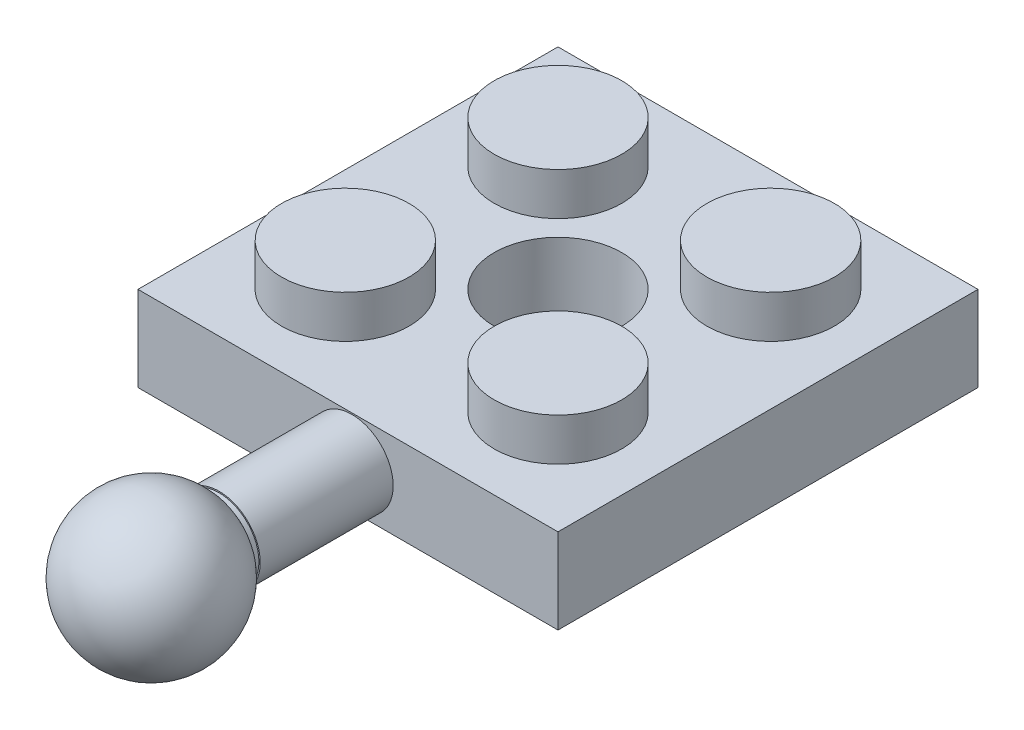
ISO-10303-21;
HEADER;
FILE_DESCRIPTION(('STEP AP214'),'2;1');
FILE_NAME('part.step','',(''),(''),'','','');
FILE_SCHEMA(('AUTOMOTIVE_DESIGN { 1 0 10303 214 1 1 1 1 }'));
ENDSEC;
DATA;
#1=APPLICATION_CONTEXT('core data for automotive mechanical design processes');
#2=APPLICATION_PROTOCOL_DEFINITION('international standard','automotive_design',2000,#1);
#3=PRODUCT_CONTEXT('',#1,'mechanical');
#4=PRODUCT('Part','Part','',(#3));
#5=PRODUCT_RELATED_PRODUCT_CATEGORY('part','',(#4));
#6=PRODUCT_DEFINITION_FORMATION('','',#4);
#7=PRODUCT_DEFINITION_CONTEXT('part definition',#1,'design');
#8=PRODUCT_DEFINITION('design','',#6,#7);
#9=PRODUCT_DEFINITION_SHAPE('','',#8);
#10=(LENGTH_UNIT() NAMED_UNIT(*) SI_UNIT(.MILLI.,.METRE.));
#11=(NAMED_UNIT(*) PLANE_ANGLE_UNIT() SI_UNIT($,.RADIAN.));
#12=(NAMED_UNIT(*) SI_UNIT($,.STERADIAN.) SOLID_ANGLE_UNIT());
#13=UNCERTAINTY_MEASURE_WITH_UNIT(LENGTH_MEASURE(1.E-05),#10,'distance_accuracy_value','');
#14=(GEOMETRIC_REPRESENTATION_CONTEXT(3) GLOBAL_UNCERTAINTY_ASSIGNED_CONTEXT((#13)) GLOBAL_UNIT_ASSIGNED_CONTEXT((#10,
#11,#12)) REPRESENTATION_CONTEXT('',''));
#15=CARTESIAN_POINT('',(0.,0.,0.));
#16=DIRECTION('',(0.,0.,1.));
#17=DIRECTION('',(1.,0.,0.));
#18=AXIS2_PLACEMENT_3D('',#15,#16,#17);
#19=CARTESIAN_POINT('',(0.,0.,-15.8));
#20=DIRECTION('',(0.,-1.,0.));
#21=DIRECTION('',(0.,0.,-1.));
#22=AXIS2_PLACEMENT_3D('',#19,#20,#21);
#23=PLANE('',#22);
#24=DIRECTION('',(1.,0.,0.));
#25=VECTOR('',#24,1.);
#26=CARTESIAN_POINT('',(0.,0.,0.));
#27=LINE('',#26,#25);
#28=CARTESIAN_POINT('',(0.,0.,0.));
#29=VERTEX_POINT('',#28);
#30=CARTESIAN_POINT('',(15.8,0.,0.));
#31=VERTEX_POINT('',#30);
#32=EDGE_CURVE('E198',#29,#31,#27,.T.);
#33=ORIENTED_EDGE('',*,*,#32,.F.);
#34=DIRECTION('',(0.,0.,1.));
#35=VECTOR('',#34,1.);
#36=CARTESIAN_POINT('',(0.,0.,-15.8));
#37=LINE('',#36,#35);
#38=CARTESIAN_POINT('',(0.,0.,-15.8));
#39=VERTEX_POINT('',#38);
#40=EDGE_CURVE('E93',#39,#29,#37,.T.);
#41=ORIENTED_EDGE('',*,*,#40,.F.);
#42=DIRECTION('',(1.,0.,0.));
#43=VECTOR('',#42,1.);
#44=CARTESIAN_POINT('',(0.,0.,-15.8));
#45=LINE('',#44,#43);
#46=CARTESIAN_POINT('',(15.8,0.,-15.8));
#47=VERTEX_POINT('',#46);
#48=EDGE_CURVE('E188',#39,#47,#45,.T.);
#49=ORIENTED_EDGE('',*,*,#48,.T.);
#50=DIRECTION('',(0.,0.,1.));
#51=VECTOR('',#50,1.);
#52=CARTESIAN_POINT('',(15.8,0.,-15.8));
#53=LINE('',#52,#51);
#54=EDGE_CURVE('E210',#47,#31,#53,.T.);
#55=ORIENTED_EDGE('',*,*,#54,.T.);
#56=EDGE_LOOP('',(#33,#41,#49,#55));
#57=FACE_BOUND('',#56,.T.);
#58=DIRECTION('',(0.,0.,1.));
#59=VECTOR('',#58,1.);
#60=CARTESIAN_POINT('',(1.2,0.,-15.8));
#61=LINE('',#60,#59);
#62=CARTESIAN_POINT('',(1.2,0.,-14.6));
#63=VERTEX_POINT('',#62);
#64=CARTESIAN_POINT('',(1.2,0.,-1.2));
#65=VERTEX_POINT('',#64);
#66=EDGE_CURVE('E138',#63,#65,#61,.T.);
#67=ORIENTED_EDGE('',*,*,#66,.T.);
#68=DIRECTION('',(1.,0.,0.));
#69=VECTOR('',#68,1.);
#70=CARTESIAN_POINT('',(0.,0.,-1.2));
#71=LINE('',#70,#69);
#72=CARTESIAN_POINT('',(14.6,0.,-1.2));
#73=VERTEX_POINT('',#72);
#74=EDGE_CURVE('E155',#65,#73,#71,.T.);
#75=ORIENTED_EDGE('',*,*,#74,.T.);
#76=DIRECTION('',(0.,0.,1.));
#77=VECTOR('',#76,1.);
#78=CARTESIAN_POINT('',(14.6,0.,-15.8));
#79=LINE('',#78,#77);
#80=CARTESIAN_POINT('',(14.6,0.,-14.6));
#81=VERTEX_POINT('',#80);
#82=EDGE_CURVE('E129',#81,#73,#79,.T.);
#83=ORIENTED_EDGE('',*,*,#82,.F.);
#84=DIRECTION('',(1.,0.,0.));
#85=VECTOR('',#84,1.);
#86=CARTESIAN_POINT('',(0.,0.,-14.6));
#87=LINE('',#86,#85);
#88=EDGE_CURVE('E58',#63,#81,#87,.T.);
#89=ORIENTED_EDGE('',*,*,#88,.F.);
#90=EDGE_LOOP('',(#67,#75,#83,#89));
#91=FACE_BOUND('',#90,.T.);
#92=ADVANCED_FACE('F41',(#57,#91),#23,.T.);
#93=CARTESIAN_POINT('',(11.9,4.8,-11.9));
#94=DIRECTION('',(0.,1.,0.));
#95=DIRECTION('',(0.,0.,1.));
#96=AXIS2_PLACEMENT_3D('',#93,#94,#95);
#97=PLANE('',#96);
#98=CARTESIAN_POINT('',(11.9,4.8,-11.9));
#99=DIRECTION('',(0.,1.,0.));
#100=DIRECTION('',(0.,0.,1.));
#101=AXIS2_PLACEMENT_3D('',#98,#99,#100);
#102=CIRCLE('',#101,2.4);
#103=CARTESIAN_POINT('',(11.9,4.8,-9.5));
#104=VERTEX_POINT('',#103);
#105=EDGE_CURVE('E221',#104,#104,#102,.T.);
#106=ORIENTED_EDGE('',*,*,#105,.T.);
#107=EDGE_LOOP('',(#106));
#108=FACE_BOUND('',#107,.T.);
#109=ADVANCED_FACE('F43',(#108),#97,.T.);
#110=CARTESIAN_POINT('',(11.9,4.8,-11.9));
#111=DIRECTION('',(0.,-1.,0.));
#112=DIRECTION('',(0.,0.,-1.));
#113=AXIS2_PLACEMENT_3D('',#110,#111,#112);
#114=CYLINDRICAL_SURFACE('',#113,2.4);
#115=ORIENTED_EDGE('',*,*,#105,.F.);
#116=EDGE_LOOP('',(#115));
#117=FACE_BOUND('',#116,.T.);
#118=CARTESIAN_POINT('',(11.9,3.2,-11.9));
#119=DIRECTION('',(0.,1.,0.));
#120=DIRECTION('',(0.,0.,1.));
#121=AXIS2_PLACEMENT_3D('',#118,#119,#120);
#122=CIRCLE('',#121,2.4);
#123=CARTESIAN_POINT('',(11.9,3.2,-9.5));
#124=VERTEX_POINT('',#123);
#125=EDGE_CURVE('E218',#124,#124,#122,.T.);
#126=ORIENTED_EDGE('',*,*,#125,.T.);
#127=EDGE_LOOP('',(#126));
#128=FACE_BOUND('',#127,.T.);
#129=ADVANCED_FACE('F252',(#117,#128),#114,.T.);
#130=CARTESIAN_POINT('',(11.9,4.8,-3.9));
#131=DIRECTION('',(0.,1.,0.));
#132=DIRECTION('',(0.,0.,1.));
#133=AXIS2_PLACEMENT_3D('',#130,#131,#132);
#134=PLANE('',#133);
#135=CARTESIAN_POINT('',(11.9,4.8,-3.9));
#136=DIRECTION('',(0.,1.,0.));
#137=DIRECTION('',(0.,0.,1.));
#138=AXIS2_PLACEMENT_3D('',#135,#136,#137);
#139=CIRCLE('',#138,2.4);
#140=CARTESIAN_POINT('',(11.9,4.8,-1.5));
#141=VERTEX_POINT('',#140);
#142=EDGE_CURVE('E215',#141,#141,#139,.T.);
#143=ORIENTED_EDGE('',*,*,#142,.T.);
#144=EDGE_LOOP('',(#143));
#145=FACE_BOUND('',#144,.T.);
#146=ADVANCED_FACE('F265',(#145),#134,.T.);
#147=CARTESIAN_POINT('',(11.9,4.8,-3.9));
#148=DIRECTION('',(0.,-1.,0.));
#149=DIRECTION('',(0.,0.,-1.));
#150=AXIS2_PLACEMENT_3D('',#147,#148,#149);
#151=CYLINDRICAL_SURFACE('',#150,2.4);
#152=ORIENTED_EDGE('',*,*,#142,.F.);
#153=EDGE_LOOP('',(#152));
#154=FACE_BOUND('',#153,.T.);
#155=CARTESIAN_POINT('',(11.9,3.2,-3.9));
#156=DIRECTION('',(0.,1.,0.));
#157=DIRECTION('',(0.,0.,1.));
#158=AXIS2_PLACEMENT_3D('',#155,#156,#157);
#159=CIRCLE('',#158,2.4);
#160=CARTESIAN_POINT('',(11.9,3.2,-1.5));
#161=VERTEX_POINT('',#160);
#162=EDGE_CURVE('E207',#161,#161,#159,.T.);
#163=ORIENTED_EDGE('',*,*,#162,.T.);
#164=EDGE_LOOP('',(#163));
#165=FACE_BOUND('',#164,.T.);
#166=ADVANCED_FACE('F262',(#154,#165),#151,.T.);
#167=CARTESIAN_POINT('',(0.,0.,-15.8));
#168=DIRECTION('',(-1.,0.,0.));
#169=DIRECTION('',(0.,0.,1.));
#170=AXIS2_PLACEMENT_3D('',#167,#168,#169);
#171=PLANE('',#170);
#172=DIRECTION('',(0.,-1.,0.));
#173=VECTOR('',#172,1.);
#174=CARTESIAN_POINT('',(0.,0.,0.));
#175=LINE('',#174,#173);
#176=CARTESIAN_POINT('',(0.,3.2,0.));
#177=VERTEX_POINT('',#176);
#178=EDGE_CURVE('E183',#177,#29,#175,.T.);
#179=ORIENTED_EDGE('',*,*,#178,.F.);
#180=DIRECTION('',(0.,0.,1.));
#181=VECTOR('',#180,1.);
#182=CARTESIAN_POINT('',(0.,3.2,-15.8));
#183=LINE('',#182,#181);
#184=CARTESIAN_POINT('',(0.,3.2,-15.8));
#185=VERTEX_POINT('',#184);
#186=EDGE_CURVE('E67',#185,#177,#183,.T.);
#187=ORIENTED_EDGE('',*,*,#186,.F.);
#188=DIRECTION('',(0.,-1.,0.));
#189=VECTOR('',#188,1.);
#190=CARTESIAN_POINT('',(0.,0.,-15.8));
#191=LINE('',#190,#189);
#192=EDGE_CURVE('E186',#185,#39,#191,.T.);
#193=ORIENTED_EDGE('',*,*,#192,.T.);
#194=ORIENTED_EDGE('',*,*,#40,.T.);
#195=EDGE_LOOP('',(#179,#187,#193,#194));
#196=FACE_BOUND('',#195,.T.);
#197=ADVANCED_FACE('F258',(#196),#171,.T.);
#198=CARTESIAN_POINT('',(0.,3.2,-15.8));
#199=DIRECTION('',(0.,1.,0.));
#200=DIRECTION('',(0.,0.,1.));
#201=AXIS2_PLACEMENT_3D('',#198,#199,#200);
#202=PLANE('',#201);
#203=CARTESIAN_POINT('',(7.9,3.2,-7.9));
#204=DIRECTION('',(0.,1.,0.));
#205=DIRECTION('',(0.,0.,1.));
#206=AXIS2_PLACEMENT_3D('',#203,#204,#205);
#207=CIRCLE('',#206,2.4);
#208=CARTESIAN_POINT('',(7.9,3.2,-5.5));
#209=VERTEX_POINT('',#208);
#210=EDGE_CURVE('E45',#209,#209,#207,.T.);
#211=ORIENTED_EDGE('',*,*,#210,.F.);
#212=EDGE_LOOP('',(#211));
#213=FACE_BOUND('',#212,.T.);
#214=CARTESIAN_POINT('',(3.9,3.2,-11.9));
#215=DIRECTION('',(0.,1.,0.));
#216=DIRECTION('',(0.,0.,1.));
#217=AXIS2_PLACEMENT_3D('',#214,#215,#216);
#218=CIRCLE('',#217,2.4);
#219=CARTESIAN_POINT('',(3.9,3.2,-9.5));
#220=VERTEX_POINT('',#219);
#221=EDGE_CURVE('E172',#220,#220,#218,.T.);
#222=ORIENTED_EDGE('',*,*,#221,.F.);
#223=EDGE_LOOP('',(#222));
#224=FACE_BOUND('',#223,.T.);
#225=CARTESIAN_POINT('',(3.9,3.2,-3.9));
#226=DIRECTION('',(0.,1.,0.));
#227=DIRECTION('',(0.,0.,1.));
#228=AXIS2_PLACEMENT_3D('',#225,#226,#227);
#229=CIRCLE('',#228,2.4);
#230=CARTESIAN_POINT('',(3.9,3.2,-1.5));
#231=VERTEX_POINT('',#230);
#232=EDGE_CURVE('E179',#231,#231,#229,.T.);
#233=ORIENTED_EDGE('',*,*,#232,.F.);
#234=EDGE_LOOP('',(#233));
#235=FACE_BOUND('',#234,.T.);
#236=DIRECTION('',(-1.,0.,0.));
#237=VECTOR('',#236,1.);
#238=CARTESIAN_POINT('',(0.,3.2,0.));
#239=LINE('',#238,#237);
#240=CARTESIAN_POINT('',(15.8,3.2,0.));
#241=VERTEX_POINT('',#240);
#242=EDGE_CURVE('E189',#241,#177,#239,.T.);
#243=ORIENTED_EDGE('',*,*,#242,.F.);
#244=DIRECTION('',(0.,0.,1.));
#245=VECTOR('',#244,1.);
#246=CARTESIAN_POINT('',(15.8,3.2,-15.8));
#247=LINE('',#246,#245);
#248=CARTESIAN_POINT('',(15.8,3.2,-15.8));
#249=VERTEX_POINT('',#248);
#250=EDGE_CURVE('E208',#249,#241,#247,.T.);
#251=ORIENTED_EDGE('',*,*,#250,.F.);
#252=DIRECTION('',(-1.,0.,0.));
#253=VECTOR('',#252,1.);
#254=CARTESIAN_POINT('',(0.,3.2,-15.8));
#255=LINE('',#254,#253);
#256=EDGE_CURVE('E194',#249,#185,#255,.T.);
#257=ORIENTED_EDGE('',*,*,#256,.T.);
#258=ORIENTED_EDGE('',*,*,#186,.T.);
#259=EDGE_LOOP('',(#243,#251,#257,#258));
#260=FACE_BOUND('',#259,.T.);
#261=ORIENTED_EDGE('',*,*,#162,.F.);
#262=EDGE_LOOP('',(#261));
#263=FACE_BOUND('',#262,.T.);
#264=ORIENTED_EDGE('',*,*,#125,.F.);
#265=EDGE_LOOP('',(#264));
#266=FACE_BOUND('',#265,.T.);
#267=ADVANCED_FACE('F261',(#213,#224,#235,#260,#263,#266),#202,.T.);
#268=CARTESIAN_POINT('',(15.8,0.,-15.8));
#269=DIRECTION('',(1.,0.,0.));
#270=DIRECTION('',(0.,0.,-1.));
#271=AXIS2_PLACEMENT_3D('',#268,#269,#270);
#272=PLANE('',#271);
#273=DIRECTION('',(0.,1.,0.));
#274=VECTOR('',#273,1.);
#275=CARTESIAN_POINT('',(15.8,0.,0.));
#276=LINE('',#275,#274);
#277=EDGE_CURVE('E201',#31,#241,#276,.T.);
#278=ORIENTED_EDGE('',*,*,#277,.F.);
#279=ORIENTED_EDGE('',*,*,#54,.F.);
#280=DIRECTION('',(0.,1.,0.));
#281=VECTOR('',#280,1.);
#282=CARTESIAN_POINT('',(15.8,0.,-15.8));
#283=LINE('',#282,#281);
#284=EDGE_CURVE('E191',#47,#249,#283,.T.);
#285=ORIENTED_EDGE('',*,*,#284,.T.);
#286=ORIENTED_EDGE('',*,*,#250,.T.);
#287=EDGE_LOOP('',(#278,#279,#285,#286));
#288=FACE_BOUND('',#287,.T.);
#289=ADVANCED_FACE('F256',(#288),#272,.T.);
#290=CARTESIAN_POINT('',(0.,0.,-15.8));
#291=DIRECTION('',(0.,0.,-1.));
#292=DIRECTION('',(-1.,0.,0.));
#293=AXIS2_PLACEMENT_3D('',#290,#291,#292);
#294=PLANE('',#293);
#295=ORIENTED_EDGE('',*,*,#192,.F.);
#296=ORIENTED_EDGE('',*,*,#256,.F.);
#297=ORIENTED_EDGE('',*,*,#284,.F.);
#298=ORIENTED_EDGE('',*,*,#48,.F.);
#299=EDGE_LOOP('',(#295,#296,#297,#298));
#300=FACE_BOUND('',#299,.T.);
#301=ADVANCED_FACE('F284',(#300),#294,.T.);
#302=CARTESIAN_POINT('',(0.,0.,0.));
#303=DIRECTION('',(0.,0.,-1.));
#304=DIRECTION('',(-1.,0.,0.));
#305=AXIS2_PLACEMENT_3D('',#302,#303,#304);
#306=PLANE('',#305);
#307=CARTESIAN_POINT('',(8.05,1.6,0.));
#308=DIRECTION('',(0.,0.,1.));
#309=DIRECTION('',(1.,0.,0.));
#310=AXIS2_PLACEMENT_3D('',#307,#308,#309);
#311=CIRCLE('',#310,1.55);
#312=CARTESIAN_POINT('',(9.6,1.6,0.));
#313=VERTEX_POINT('',#312);
#314=EDGE_CURVE('E12',#313,#313,#311,.T.);
#315=ORIENTED_EDGE('',*,*,#314,.F.);
#316=EDGE_LOOP('',(#315));
#317=FACE_BOUND('',#316,.T.);
#318=ORIENTED_EDGE('',*,*,#178,.T.);
#319=ORIENTED_EDGE('',*,*,#32,.T.);
#320=ORIENTED_EDGE('',*,*,#277,.T.);
#321=ORIENTED_EDGE('',*,*,#242,.T.);
#322=EDGE_LOOP('',(#318,#319,#320,#321));
#323=FACE_BOUND('',#322,.T.);
#324=ADVANCED_FACE('F289',(#317,#323),#306,.F.);
#325=CARTESIAN_POINT('',(3.9,4.8,-3.9));
#326=DIRECTION('',(0.,-1.,0.));
#327=DIRECTION('',(0.,0.,-1.));
#328=AXIS2_PLACEMENT_3D('',#325,#326,#327);
#329=CYLINDRICAL_SURFACE('',#328,2.4);
#330=CARTESIAN_POINT('',(3.9,4.8,-3.9));
#331=DIRECTION('',(0.,1.,0.));
#332=DIRECTION('',(0.,0.,1.));
#333=AXIS2_PLACEMENT_3D('',#330,#331,#332);
#334=CIRCLE('',#333,2.4);
#335=CARTESIAN_POINT('',(3.9,4.8,-1.5));
#336=VERTEX_POINT('',#335);
#337=EDGE_CURVE('E180',#336,#336,#334,.T.);
#338=ORIENTED_EDGE('',*,*,#337,.F.);
#339=EDGE_LOOP('',(#338));
#340=FACE_BOUND('',#339,.T.);
#341=ORIENTED_EDGE('',*,*,#232,.T.);
#342=EDGE_LOOP('',(#341));
#343=FACE_BOUND('',#342,.T.);
#344=ADVANCED_FACE('F292',(#340,#343),#329,.T.);
#345=CARTESIAN_POINT('',(3.9,4.8,-3.9));
#346=DIRECTION('',(0.,1.,0.));
#347=DIRECTION('',(0.,0.,1.));
#348=AXIS2_PLACEMENT_3D('',#345,#346,#347);
#349=PLANE('',#348);
#350=ORIENTED_EDGE('',*,*,#337,.T.);
#351=EDGE_LOOP('',(#350));
#352=FACE_BOUND('',#351,.T.);
#353=ADVANCED_FACE('F299',(#352),#349,.T.);
#354=CARTESIAN_POINT('',(3.9,4.8,-11.9));
#355=DIRECTION('',(0.,-1.,0.));
#356=DIRECTION('',(0.,0.,-1.));
#357=AXIS2_PLACEMENT_3D('',#354,#355,#356);
#358=CYLINDRICAL_SURFACE('',#357,2.4);
#359=CARTESIAN_POINT('',(3.9,4.8,-11.9));
#360=DIRECTION('',(0.,1.,0.));
#361=DIRECTION('',(0.,0.,1.));
#362=AXIS2_PLACEMENT_3D('',#359,#360,#361);
#363=CIRCLE('',#362,2.4);
#364=CARTESIAN_POINT('',(3.9,4.8,-9.5));
#365=VERTEX_POINT('',#364);
#366=EDGE_CURVE('E175',#365,#365,#363,.T.);
#367=ORIENTED_EDGE('',*,*,#366,.F.);
#368=EDGE_LOOP('',(#367));
#369=FACE_BOUND('',#368,.T.);
#370=ORIENTED_EDGE('',*,*,#221,.T.);
#371=EDGE_LOOP('',(#370));
#372=FACE_BOUND('',#371,.T.);
#373=ADVANCED_FACE('F303',(#369,#372),#358,.T.);
#374=CARTESIAN_POINT('',(3.9,4.8,-11.9));
#375=DIRECTION('',(0.,1.,0.));
#376=DIRECTION('',(0.,0.,1.));
#377=AXIS2_PLACEMENT_3D('',#374,#375,#376);
#378=PLANE('',#377);
#379=ORIENTED_EDGE('',*,*,#366,.T.);
#380=EDGE_LOOP('',(#379));
#381=FACE_BOUND('',#380,.T.);
#382=ADVANCED_FACE('F307',(#381),#378,.T.);
#383=CARTESIAN_POINT('',(11.9,3.6,-11.9));
#384=DIRECTION('',(0.,1.,0.));
#385=DIRECTION('',(0.,0.,1.));
#386=AXIS2_PLACEMENT_3D('',#383,#384,#385);
#387=PLANE('',#386);
#388=CARTESIAN_POINT('',(11.9,3.6,-11.9));
#389=DIRECTION('',(0.,1.,0.));
#390=DIRECTION('',(0.,0.,1.));
#391=AXIS2_PLACEMENT_3D('',#388,#389,#390);
#392=CIRCLE('',#391,1.2);
#393=CARTESIAN_POINT('',(11.9,3.6,-10.7));
#394=VERTEX_POINT('',#393);
#395=EDGE_CURVE('E176',#394,#394,#392,.T.);
#396=ORIENTED_EDGE('',*,*,#395,.F.);
#397=EDGE_LOOP('',(#396));
#398=FACE_BOUND('',#397,.T.);
#399=ADVANCED_FACE('F311',(#398),#387,.F.);
#400=CARTESIAN_POINT('',(11.9,4.8,-11.9));
#401=DIRECTION('',(0.,-1.,0.));
#402=DIRECTION('',(0.,0.,-1.));
#403=AXIS2_PLACEMENT_3D('',#400,#401,#402);
#404=CYLINDRICAL_SURFACE('',#403,1.2);
#405=ORIENTED_EDGE('',*,*,#395,.T.);
#406=EDGE_LOOP('',(#405));
#407=FACE_BOUND('',#406,.T.);
#408=CARTESIAN_POINT('',(11.9,2.,-11.9));
#409=DIRECTION('',(0.,1.,0.));
#410=DIRECTION('',(0.,0.,1.));
#411=AXIS2_PLACEMENT_3D('',#408,#409,#410);
#412=CIRCLE('',#411,1.2);
#413=CARTESIAN_POINT('',(11.9,2.,-10.7));
#414=VERTEX_POINT('',#413);
#415=EDGE_CURVE('E151',#414,#414,#412,.T.);
#416=ORIENTED_EDGE('',*,*,#415,.F.);
#417=EDGE_LOOP('',(#416));
#418=FACE_BOUND('',#417,.T.);
#419=ADVANCED_FACE('F344',(#407,#418),#404,.F.);
#420=CARTESIAN_POINT('',(11.9,3.6,-3.9));
#421=DIRECTION('',(0.,1.,0.));
#422=DIRECTION('',(0.,0.,1.));
#423=AXIS2_PLACEMENT_3D('',#420,#421,#422);
#424=PLANE('',#423);
#425=CARTESIAN_POINT('',(11.9,3.6,-3.9));
#426=DIRECTION('',(0.,1.,0.));
#427=DIRECTION('',(0.,0.,1.));
#428=AXIS2_PLACEMENT_3D('',#425,#426,#427);
#429=CIRCLE('',#428,1.2);
#430=CARTESIAN_POINT('',(11.9,3.6,-2.7));
#431=VERTEX_POINT('',#430);
#432=EDGE_CURVE('E148',#431,#431,#429,.T.);
#433=ORIENTED_EDGE('',*,*,#432,.F.);
#434=EDGE_LOOP('',(#433));
#435=FACE_BOUND('',#434,.T.);
#436=ADVANCED_FACE('F340',(#435),#424,.F.);
#437=CARTESIAN_POINT('',(11.9,4.8,-3.9));
#438=DIRECTION('',(0.,-1.,0.));
#439=DIRECTION('',(0.,0.,-1.));
#440=AXIS2_PLACEMENT_3D('',#437,#438,#439);
#441=CYLINDRICAL_SURFACE('',#440,1.2);
#442=ORIENTED_EDGE('',*,*,#432,.T.);
#443=EDGE_LOOP('',(#442));
#444=FACE_BOUND('',#443,.T.);
#445=CARTESIAN_POINT('',(11.9,2.,-3.9));
#446=DIRECTION('',(0.,1.,0.));
#447=DIRECTION('',(0.,0.,1.));
#448=AXIS2_PLACEMENT_3D('',#445,#446,#447);
#449=CIRCLE('',#448,1.2);
#450=CARTESIAN_POINT('',(11.9,2.,-2.7));
#451=VERTEX_POINT('',#450);
#452=EDGE_CURVE('E145',#451,#451,#449,.T.);
#453=ORIENTED_EDGE('',*,*,#452,.F.);
#454=EDGE_LOOP('',(#453));
#455=FACE_BOUND('',#454,.T.);
#456=ADVANCED_FACE('F337',(#444,#455),#441,.F.);
#457=CARTESIAN_POINT('',(1.2,0.,-15.8));
#458=DIRECTION('',(-1.,0.,0.));
#459=DIRECTION('',(0.,0.,1.));
#460=AXIS2_PLACEMENT_3D('',#457,#458,#459);
#461=PLANE('',#460);
#462=DIRECTION('',(0.,-1.,0.));
#463=VECTOR('',#462,1.);
#464=CARTESIAN_POINT('',(1.2,0.,-1.2));
#465=LINE('',#464,#463);
#466=CARTESIAN_POINT('',(1.2,2.,-1.2));
#467=VERTEX_POINT('',#466);
#468=EDGE_CURVE('E152',#467,#65,#465,.T.);
#469=ORIENTED_EDGE('',*,*,#468,.T.);
#470=ORIENTED_EDGE('',*,*,#66,.F.);
#471=DIRECTION('',(0.,-1.,0.));
#472=VECTOR('',#471,1.);
#473=CARTESIAN_POINT('',(1.2,0.,-14.6));
#474=LINE('',#473,#472);
#475=CARTESIAN_POINT('',(1.2,2.,-14.6));
#476=VERTEX_POINT('',#475);
#477=EDGE_CURVE('E157',#476,#63,#474,.T.);
#478=ORIENTED_EDGE('',*,*,#477,.F.);
#479=DIRECTION('',(0.,0.,1.));
#480=VECTOR('',#479,1.);
#481=CARTESIAN_POINT('',(1.2,2.,-15.8));
#482=LINE('',#481,#480);
#483=EDGE_CURVE('E128',#476,#467,#482,.T.);
#484=ORIENTED_EDGE('',*,*,#483,.T.);
#485=EDGE_LOOP('',(#469,#470,#478,#484));
#486=FACE_BOUND('',#485,.T.);
#487=ADVANCED_FACE('F231',(#486),#461,.F.);
#488=CARTESIAN_POINT('',(0.,2.,-15.8));
#489=DIRECTION('',(0.,1.,0.));
#490=DIRECTION('',(0.,0.,1.));
#491=AXIS2_PLACEMENT_3D('',#488,#489,#490);
#492=PLANE('',#491);
#493=CARTESIAN_POINT('',(7.9,2.,-7.9));
#494=DIRECTION('',(0.,1.,0.));
#495=DIRECTION('',(0.,0.,1.));
#496=AXIS2_PLACEMENT_3D('',#493,#494,#495);
#497=CIRCLE('',#496,3.25);
#498=CARTESIAN_POINT('',(7.9,2.,-4.65));
#499=VERTEX_POINT('',#498);
#500=EDGE_CURVE('E50',#499,#499,#497,.F.);
#501=ORIENTED_EDGE('',*,*,#500,.F.);
#502=EDGE_LOOP('',(#501));
#503=FACE_BOUND('',#502,.T.);
#504=CARTESIAN_POINT('',(3.9,2.,-11.9));
#505=DIRECTION('',(0.,1.,0.));
#506=DIRECTION('',(0.,0.,1.));
#507=AXIS2_PLACEMENT_3D('',#504,#505,#506);
#508=CIRCLE('',#507,1.2);
#509=CARTESIAN_POINT('',(3.9,2.,-10.7));
#510=VERTEX_POINT('',#509);
#511=EDGE_CURVE('E166',#510,#510,#508,.T.);
#512=ORIENTED_EDGE('',*,*,#511,.T.);
#513=EDGE_LOOP('',(#512));
#514=FACE_BOUND('',#513,.T.);
#515=CARTESIAN_POINT('',(3.9,2.,-3.9));
#516=DIRECTION('',(0.,1.,0.));
#517=DIRECTION('',(0.,0.,1.));
#518=AXIS2_PLACEMENT_3D('',#515,#516,#517);
#519=CIRCLE('',#518,1.2);
#520=CARTESIAN_POINT('',(3.9,2.,-2.7));
#521=VERTEX_POINT('',#520);
#522=EDGE_CURVE('E163',#521,#521,#519,.T.);
#523=ORIENTED_EDGE('',*,*,#522,.T.);
#524=EDGE_LOOP('',(#523));
#525=FACE_BOUND('',#524,.T.);
#526=DIRECTION('',(-1.,0.,0.));
#527=VECTOR('',#526,1.);
#528=CARTESIAN_POINT('',(0.,2.,-1.2));
#529=LINE('',#528,#527);
#530=CARTESIAN_POINT('',(14.6,2.,-1.2));
#531=VERTEX_POINT('',#530);
#532=EDGE_CURVE('E158',#531,#467,#529,.T.);
#533=ORIENTED_EDGE('',*,*,#532,.T.);
#534=ORIENTED_EDGE('',*,*,#483,.F.);
#535=DIRECTION('',(-1.,0.,0.));
#536=VECTOR('',#535,1.);
#537=CARTESIAN_POINT('',(0.,2.,-14.6));
#538=LINE('',#537,#536);
#539=CARTESIAN_POINT('',(14.6,2.,-14.6));
#540=VERTEX_POINT('',#539);
#541=EDGE_CURVE('E133',#540,#476,#538,.T.);
#542=ORIENTED_EDGE('',*,*,#541,.F.);
#543=DIRECTION('',(0.,0.,1.));
#544=VECTOR('',#543,1.);
#545=CARTESIAN_POINT('',(14.6,2.,-15.8));
#546=LINE('',#545,#544);
#547=EDGE_CURVE('E118',#540,#531,#546,.T.);
#548=ORIENTED_EDGE('',*,*,#547,.T.);
#549=EDGE_LOOP('',(#533,#534,#542,#548));
#550=FACE_BOUND('',#549,.T.);
#551=ORIENTED_EDGE('',*,*,#452,.T.);
#552=EDGE_LOOP('',(#551));
#553=FACE_BOUND('',#552,.T.);
#554=ORIENTED_EDGE('',*,*,#415,.T.);
#555=EDGE_LOOP('',(#554));
#556=FACE_BOUND('',#555,.T.);
#557=ADVANCED_FACE('F135',(#503,#514,#525,#550,#553,#556),#492,.F.);
#558=CARTESIAN_POINT('',(14.6,0.,-15.8));
#559=DIRECTION('',(1.,0.,0.));
#560=DIRECTION('',(0.,0.,-1.));
#561=AXIS2_PLACEMENT_3D('',#558,#559,#560);
#562=PLANE('',#561);
#563=DIRECTION('',(0.,1.,0.));
#564=VECTOR('',#563,1.);
#565=CARTESIAN_POINT('',(14.6,0.,-1.2));
#566=LINE('',#565,#564);
#567=EDGE_CURVE('E123',#73,#531,#566,.T.);
#568=ORIENTED_EDGE('',*,*,#567,.T.);
#569=ORIENTED_EDGE('',*,*,#547,.F.);
#570=DIRECTION('',(0.,1.,0.));
#571=VECTOR('',#570,1.);
#572=CARTESIAN_POINT('',(14.6,0.,-14.6));
#573=LINE('',#572,#571);
#574=EDGE_CURVE('E120',#81,#540,#573,.T.);
#575=ORIENTED_EDGE('',*,*,#574,.F.);
#576=ORIENTED_EDGE('',*,*,#82,.T.);
#577=EDGE_LOOP('',(#568,#569,#575,#576));
#578=FACE_BOUND('',#577,.T.);
#579=ADVANCED_FACE('F119',(#578),#562,.F.);
#580=CARTESIAN_POINT('',(0.,0.,-14.6));
#581=DIRECTION('',(0.,0.,-1.));
#582=DIRECTION('',(-1.,0.,0.));
#583=AXIS2_PLACEMENT_3D('',#580,#581,#582);
#584=PLANE('',#583);
#585=ORIENTED_EDGE('',*,*,#477,.T.);
#586=ORIENTED_EDGE('',*,*,#88,.T.);
#587=ORIENTED_EDGE('',*,*,#574,.T.);
#588=ORIENTED_EDGE('',*,*,#541,.T.);
#589=EDGE_LOOP('',(#585,#586,#587,#588));
#590=FACE_BOUND('',#589,.T.);
#591=ADVANCED_FACE('F132',(#590),#584,.F.);
#592=CARTESIAN_POINT('',(0.,0.,-1.2));
#593=DIRECTION('',(0.,0.,-1.));
#594=DIRECTION('',(-1.,0.,0.));
#595=AXIS2_PLACEMENT_3D('',#592,#593,#594);
#596=PLANE('',#595);
#597=ORIENTED_EDGE('',*,*,#468,.F.);
#598=ORIENTED_EDGE('',*,*,#532,.F.);
#599=ORIENTED_EDGE('',*,*,#567,.F.);
#600=ORIENTED_EDGE('',*,*,#74,.F.);
#601=EDGE_LOOP('',(#597,#598,#599,#600));
#602=FACE_BOUND('',#601,.T.);
#603=ADVANCED_FACE('F244',(#602),#596,.T.);
#604=CARTESIAN_POINT('',(3.9,4.8,-3.9));
#605=DIRECTION('',(0.,-1.,0.));
#606=DIRECTION('',(0.,0.,-1.));
#607=AXIS2_PLACEMENT_3D('',#604,#605,#606);
#608=CYLINDRICAL_SURFACE('',#607,1.2);
#609=CARTESIAN_POINT('',(3.9,3.6,-3.9));
#610=DIRECTION('',(0.,1.,0.));
#611=DIRECTION('',(0.,0.,1.));
#612=AXIS2_PLACEMENT_3D('',#609,#610,#611);
#613=CIRCLE('',#612,1.2);
#614=CARTESIAN_POINT('',(3.9,3.6,-2.7));
#615=VERTEX_POINT('',#614);
#616=EDGE_CURVE('E156',#615,#615,#613,.T.);
#617=ORIENTED_EDGE('',*,*,#616,.T.);
#618=EDGE_LOOP('',(#617));
#619=FACE_BOUND('',#618,.T.);
#620=ORIENTED_EDGE('',*,*,#522,.F.);
#621=EDGE_LOOP('',(#620));
#622=FACE_BOUND('',#621,.T.);
#623=ADVANCED_FACE('F324',(#619,#622),#608,.F.);
#624=CARTESIAN_POINT('',(3.9,3.6,-3.9));
#625=DIRECTION('',(0.,1.,0.));
#626=DIRECTION('',(0.,0.,1.));
#627=AXIS2_PLACEMENT_3D('',#624,#625,#626);
#628=PLANE('',#627);
#629=ORIENTED_EDGE('',*,*,#616,.F.);
#630=EDGE_LOOP('',(#629));
#631=FACE_BOUND('',#630,.T.);
#632=ADVANCED_FACE('F320',(#631),#628,.F.);
#633=CARTESIAN_POINT('',(3.9,4.8,-11.9));
#634=DIRECTION('',(0.,-1.,0.));
#635=DIRECTION('',(0.,0.,-1.));
#636=AXIS2_PLACEMENT_3D('',#633,#634,#635);
#637=CYLINDRICAL_SURFACE('',#636,1.2);
#638=CARTESIAN_POINT('',(3.9,3.6,-11.9));
#639=DIRECTION('',(0.,1.,0.));
#640=DIRECTION('',(0.,0.,1.));
#641=AXIS2_PLACEMENT_3D('',#638,#639,#640);
#642=CIRCLE('',#641,1.2);
#643=CARTESIAN_POINT('',(3.9,3.6,-10.7));
#644=VERTEX_POINT('',#643);
#645=EDGE_CURVE('E164',#644,#644,#642,.T.);
#646=ORIENTED_EDGE('',*,*,#645,.T.);
#647=EDGE_LOOP('',(#646));
#648=FACE_BOUND('',#647,.T.);
#649=ORIENTED_EDGE('',*,*,#511,.F.);
#650=EDGE_LOOP('',(#649));
#651=FACE_BOUND('',#650,.T.);
#652=ADVANCED_FACE('F316',(#648,#651),#637,.F.);
#653=CARTESIAN_POINT('',(3.9,3.6,-11.9));
#654=DIRECTION('',(0.,1.,0.));
#655=DIRECTION('',(0.,0.,1.));
#656=AXIS2_PLACEMENT_3D('',#653,#654,#655);
#657=PLANE('',#656);
#658=ORIENTED_EDGE('',*,*,#645,.F.);
#659=EDGE_LOOP('',(#658));
#660=FACE_BOUND('',#659,.T.);
#661=ADVANCED_FACE('F313',(#660),#657,.F.);
#662=CARTESIAN_POINT('',(7.9,-9.19238815542512,-7.9));
#663=DIRECTION('',(0.,1.,0.));
#664=DIRECTION('',(0.,0.,1.));
#665=AXIS2_PLACEMENT_3D('',#662,#663,#664);
#666=CYLINDRICAL_SURFACE('',#665,3.25);
#667=ORIENTED_EDGE('',*,*,#500,.T.);
#668=EDGE_LOOP('',(#667));
#669=FACE_BOUND('',#668,.T.);
#670=CARTESIAN_POINT('',(7.9,0.200000000000001,-7.9));
#671=DIRECTION('',(0.,-1.,0.));
#672=DIRECTION('',(0.,0.,-1.));
#673=AXIS2_PLACEMENT_3D('',#670,#671,#672);
#674=CIRCLE('',#673,3.25);
#675=CARTESIAN_POINT('',(7.9,0.200000000000001,-11.15));
#676=VERTEX_POINT('',#675);
#677=EDGE_CURVE('E390',#676,#676,#674,.T.);
#678=ORIENTED_EDGE('',*,*,#677,.F.);
#679=EDGE_LOOP('',(#678));
#680=FACE_BOUND('',#679,.T.);
#681=ADVANCED_FACE('F226',(#669,#680),#666,.T.);
#682=CARTESIAN_POINT('',(7.9,-9.19238815542512,-7.9));
#683=DIRECTION('',(0.,1.,0.));
#684=DIRECTION('',(0.,0.,1.));
#685=AXIS2_PLACEMENT_3D('',#682,#683,#684);
#686=CYLINDRICAL_SURFACE('',#685,2.4);
#687=CARTESIAN_POINT('',(7.9,0.200000000000001,-7.9));
#688=DIRECTION('',(0.,-1.,0.));
#689=DIRECTION('',(0.,0.,-1.));
#690=AXIS2_PLACEMENT_3D('',#687,#688,#689);
#691=CIRCLE('',#690,2.4);
#692=CARTESIAN_POINT('',(7.9,0.200000000000001,-10.3));
#693=VERTEX_POINT('',#692);
#694=EDGE_CURVE('E393',#693,#693,#691,.T.);
#695=ORIENTED_EDGE('',*,*,#694,.T.);
#696=EDGE_LOOP('',(#695));
#697=FACE_BOUND('',#696,.T.);
#698=ORIENTED_EDGE('',*,*,#210,.T.);
#699=EDGE_LOOP('',(#698));
#700=FACE_BOUND('',#699,.T.);
#701=ADVANCED_FACE('F354',(#697,#700),#686,.F.);
#702=CARTESIAN_POINT('',(0.,0.2,-15.8));
#703=DIRECTION('',(0.,-1.,0.));
#704=DIRECTION('',(0.,0.,-1.));
#705=AXIS2_PLACEMENT_3D('',#702,#703,#704);
#706=PLANE('',#705);
#707=ORIENTED_EDGE('',*,*,#694,.F.);
#708=EDGE_LOOP('',(#707));
#709=FACE_BOUND('',#708,.T.);
#710=ORIENTED_EDGE('',*,*,#677,.T.);
#711=EDGE_LOOP('',(#710));
#712=FACE_BOUND('',#711,.T.);
#713=ADVANCED_FACE('F357',(#709,#712),#706,.T.);
#714=CARTESIAN_POINT('',(8.05,1.6,5.));
#715=DIRECTION('',(0.,0.,-1.));
#716=DIRECTION('',(-1.,0.,0.));
#717=AXIS2_PLACEMENT_3D('',#714,#715,#716);
#718=CYLINDRICAL_SURFACE('',#717,1.55);
#719=CARTESIAN_POINT('',(8.05,1.6,5.));
#720=DIRECTION('',(0.,0.,1.));
#721=DIRECTION('',(1.,0.,0.));
#722=AXIS2_PLACEMENT_3D('',#719,#720,#721);
#723=CIRCLE('',#722,1.55);
#724=CARTESIAN_POINT('',(9.6,1.6,5.));
#725=VERTEX_POINT('',#724);
#726=EDGE_CURVE('E385',#725,#725,#723,.T.);
#727=ORIENTED_EDGE('',*,*,#726,.F.);
#728=EDGE_LOOP('',(#727));
#729=FACE_BOUND('',#728,.T.);
#730=ORIENTED_EDGE('',*,*,#314,.T.);
#731=EDGE_LOOP('',(#730));
#732=FACE_BOUND('',#731,.T.);
#733=ADVANCED_FACE('F361',(#729,#732),#718,.T.);
#734=CARTESIAN_POINT('',(8.05,1.6,5.));
#735=DIRECTION('',(0.,0.,1.));
#736=DIRECTION('',(1.,0.,0.));
#737=AXIS2_PLACEMENT_3D('',#734,#735,#736);
#738=PLANE('',#737);
#739=CARTESIAN_POINT('',(8.05,1.6,5.));
#740=DIRECTION('',(0.,0.,1.));
#741=DIRECTION('',(1.,0.,0.));
#742=AXIS2_PLACEMENT_3D('',#739,#740,#741);
#743=CIRCLE('',#742,1.5);
#744=CARTESIAN_POINT('',(9.55,1.6,5.));
#745=VERTEX_POINT('',#744);
#746=EDGE_CURVE('E382',#745,#745,#743,.T.);
#747=ORIENTED_EDGE('',*,*,#746,.F.);
#748=EDGE_LOOP('',(#747));
#749=FACE_BOUND('',#748,.T.);
#750=ORIENTED_EDGE('',*,*,#726,.T.);
#751=EDGE_LOOP('',(#750));
#752=FACE_BOUND('',#751,.T.);
#753=ADVANCED_FACE('F365',(#749,#752),#738,.T.);
#754=CARTESIAN_POINT('',(8.05,1.6,10.352));
#755=DIRECTION('',(0.,0.,-1.));
#756=DIRECTION('',(-1.,0.,0.));
#757=AXIS2_PLACEMENT_3D('',#754,#755,#756);
#758=CYLINDRICAL_SURFACE('',#757,1.5);
#759=CARTESIAN_POINT('',(8.05,1.6,5.18568191649262));
#760=DIRECTION('',(0.,0.,1.));
#761=DIRECTION('',(1.,0.,0.));
#762=AXIS2_PLACEMENT_3D('',#759,#760,#761);
#763=CIRCLE('',#762,1.5);
#764=CARTESIAN_POINT('',(9.55,1.6,5.18568191649262));
#765=VERTEX_POINT('',#764);
#766=EDGE_CURVE('E381',#765,#765,#763,.F.);
#767=ORIENTED_EDGE('',*,*,#766,.T.);
#768=EDGE_LOOP('',(#767));
#769=FACE_BOUND('',#768,.T.);
#770=ORIENTED_EDGE('',*,*,#746,.T.);
#771=EDGE_LOOP('',(#770));
#772=FACE_BOUND('',#771,.T.);
#773=ADVANCED_FACE('F369',(#769,#772),#758,.T.);
#774=CARTESIAN_POINT('',(8.05,1.6,7.55));
#775=DIRECTION('',(0.,1.,0.));
#776=DIRECTION('',(1.,0.,0.));
#777=AXIS2_PLACEMENT_3D('',#774,#775,#776);
#778=SPHERICAL_SURFACE('',#777,2.8);
#779=CARTESIAN_POINT('',(8.05,1.6,7.55));
#780=DIRECTION('',(0.,0.,1.));
#781=DIRECTION('',(1.,0.,0.));
#782=AXIS2_PLACEMENT_3D('',#779,#780,#781);
#783=SPHERICAL_SURFACE('',#782,2.8);
#784=ORIENTED_EDGE('',*,*,#766,.F.);
#785=EDGE_LOOP('',(#784));
#786=FACE_BOUND('',#785,.T.);
#787=ADVANCED_FACE('F373',(#786),#783,.T.);
#788=CLOSED_SHELL('',(#92,#109,#129,#146,#166,#197,#267,#289,#301,#324,#344,#353,#373,#382,#399,
#419,#436,#456,#487,#557,#579,#591,#603,#623,#632,#652,#661,#681,#701,#713,#733,#753,#773,#787));
#789=MANIFOLD_SOLID_BREP('B2',#788);
#790=ADVANCED_BREP_SHAPE_REPRESENTATION('',(#18,#789),#14);
#791=SHAPE_DEFINITION_REPRESENTATION(#9,#790);
ENDSEC;
END-ISO-10303-21;
